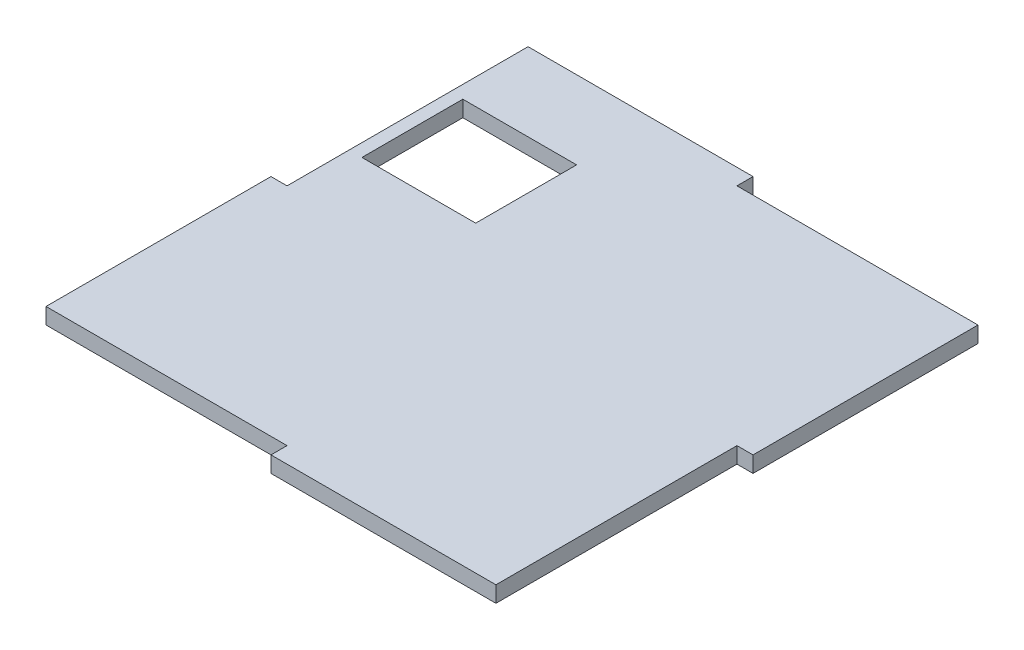
ISO-10303-21;
HEADER;
FILE_DESCRIPTION(('STEP AP214'),'2;1');
FILE_NAME('part.step','',(''),(''),'','','');
FILE_SCHEMA(('AUTOMOTIVE_DESIGN { 1 0 10303 214 1 1 1 1 }'));
ENDSEC;
DATA;
#1=APPLICATION_CONTEXT('core data for automotive mechanical design processes');
#2=APPLICATION_PROTOCOL_DEFINITION('international standard','automotive_design',2000,#1);
#3=PRODUCT_CONTEXT('',#1,'mechanical');
#4=PRODUCT('Part','Part','',(#3));
#5=PRODUCT_RELATED_PRODUCT_CATEGORY('part','',(#4));
#6=PRODUCT_DEFINITION_FORMATION('','',#4);
#7=PRODUCT_DEFINITION_CONTEXT('part definition',#1,'design');
#8=PRODUCT_DEFINITION('design','',#6,#7);
#9=PRODUCT_DEFINITION_SHAPE('','',#8);
#10=(LENGTH_UNIT() NAMED_UNIT(*) SI_UNIT(.MILLI.,.METRE.));
#11=(NAMED_UNIT(*) PLANE_ANGLE_UNIT() SI_UNIT($,.RADIAN.));
#12=(NAMED_UNIT(*) SI_UNIT($,.STERADIAN.) SOLID_ANGLE_UNIT());
#13=UNCERTAINTY_MEASURE_WITH_UNIT(LENGTH_MEASURE(1.E-05),#10,'distance_accuracy_value','');
#14=(GEOMETRIC_REPRESENTATION_CONTEXT(3) GLOBAL_UNCERTAINTY_ASSIGNED_CONTEXT((#13)) GLOBAL_UNIT_ASSIGNED_CONTEXT((#10,
#11,#12)) REPRESENTATION_CONTEXT('',''));
#15=CARTESIAN_POINT('',(0.,0.,0.));
#16=DIRECTION('',(0.,0.,1.));
#17=DIRECTION('',(1.,0.,0.));
#18=AXIS2_PLACEMENT_3D('',#15,#16,#17);
#19=CARTESIAN_POINT('',(-59.67561582829,6.35,0.));
#20=DIRECTION('',(-1.,0.,0.));
#21=DIRECTION('',(0.,0.,1.));
#22=AXIS2_PLACEMENT_3D('',#19,#20,#21);
#23=PLANE('',#22);
#24=DIRECTION('',(0.,0.,-1.));
#25=VECTOR('',#24,1.);
#26=CARTESIAN_POINT('',(-59.67561582829,0.,0.));
#27=LINE('',#26,#25);
#28=CARTESIAN_POINT('',(-59.67561582829,0.,-38.549165603342));
#29=VERTEX_POINT('',#28);
#30=CARTESIAN_POINT('',(-59.67561582829,0.,-78.427165603342));
#31=VERTEX_POINT('',#30);
#32=EDGE_CURVE('E225',#29,#31,#27,.T.);
#33=ORIENTED_EDGE('',*,*,#32,.F.);
#34=DIRECTION('',(0.,-1.,0.));
#35=VECTOR('',#34,1.);
#36=CARTESIAN_POINT('',(-59.67561582829,6.35,-38.549165603342));
#37=LINE('',#36,#35);
#38=CARTESIAN_POINT('',(-59.67561582829,6.35,-38.549165603342));
#39=VERTEX_POINT('',#38);
#40=EDGE_CURVE('E11',#39,#29,#37,.T.);
#41=ORIENTED_EDGE('',*,*,#40,.F.);
#42=DIRECTION('',(0.,0.,-1.));
#43=VECTOR('',#42,1.);
#44=CARTESIAN_POINT('',(-59.67561582829,6.35,0.));
#45=LINE('',#44,#43);
#46=CARTESIAN_POINT('',(-59.67561582829,6.35,-78.427165603342));
#47=VERTEX_POINT('',#46);
#48=EDGE_CURVE('E181',#39,#47,#45,.T.);
#49=ORIENTED_EDGE('',*,*,#48,.T.);
#50=DIRECTION('',(0.,-1.,0.));
#51=VECTOR('',#50,1.);
#52=CARTESIAN_POINT('',(-59.67561582829,6.35,-78.427165603342));
#53=LINE('',#52,#51);
#54=EDGE_CURVE('E119',#47,#31,#53,.T.);
#55=ORIENTED_EDGE('',*,*,#54,.T.);
#56=EDGE_LOOP('',(#33,#41,#49,#55));
#57=FACE_BOUND('',#56,.T.);
#58=ADVANCED_FACE('F41',(#57),#23,.T.);
#59=CARTESIAN_POINT('',(0.,6.35,-38.549165603342));
#60=DIRECTION('',(0.,0.,-1.));
#61=DIRECTION('',(-1.,0.,0.));
#62=AXIS2_PLACEMENT_3D('',#59,#60,#61);
#63=PLANE('',#62);
#64=DIRECTION('',(1.,0.,0.));
#65=VECTOR('',#64,1.);
#66=CARTESIAN_POINT('',(0.,0.,-38.549165603342));
#67=LINE('',#66,#65);
#68=CARTESIAN_POINT('',(-104.63361582829,0.,-38.549165603342));
#69=VERTEX_POINT('',#68);
#70=EDGE_CURVE('E171',#69,#29,#67,.T.);
#71=ORIENTED_EDGE('',*,*,#70,.F.);
#72=DIRECTION('',(0.,-1.,0.));
#73=VECTOR('',#72,1.);
#74=CARTESIAN_POINT('',(-104.63361582829,6.35,-38.549165603342));
#75=LINE('',#74,#73);
#76=CARTESIAN_POINT('',(-104.63361582829,6.35,-38.549165603342));
#77=VERTEX_POINT('',#76);
#78=EDGE_CURVE('E51',#77,#69,#75,.T.);
#79=ORIENTED_EDGE('',*,*,#78,.F.);
#80=DIRECTION('',(1.,0.,0.));
#81=VECTOR('',#80,1.);
#82=CARTESIAN_POINT('',(0.,6.35,-38.549165603342));
#83=LINE('',#82,#81);
#84=EDGE_CURVE('E169',#77,#39,#83,.T.);
#85=ORIENTED_EDGE('',*,*,#84,.T.);
#86=ORIENTED_EDGE('',*,*,#40,.T.);
#87=EDGE_LOOP('',(#71,#79,#85,#86));
#88=FACE_BOUND('',#87,.T.);
#89=ADVANCED_FACE('F167',(#88),#63,.T.);
#90=CARTESIAN_POINT('',(-104.63361582829,6.35,0.));
#91=DIRECTION('',(-1.,0.,0.));
#92=DIRECTION('',(0.,0.,1.));
#93=AXIS2_PLACEMENT_3D('',#90,#91,#92);
#94=PLANE('',#93);
#95=DIRECTION('',(0.,0.,-1.));
#96=VECTOR('',#95,1.);
#97=CARTESIAN_POINT('',(-104.63361582829,0.,0.));
#98=LINE('',#97,#96);
#99=CARTESIAN_POINT('',(-104.63361582829,0.,-78.427165603342));
#100=VERTEX_POINT('',#99);
#101=EDGE_CURVE('E228',#69,#100,#98,.T.);
#102=ORIENTED_EDGE('',*,*,#101,.T.);
#103=DIRECTION('',(0.,-1.,0.));
#104=VECTOR('',#103,1.);
#105=CARTESIAN_POINT('',(-104.63361582829,6.35,-78.427165603342));
#106=LINE('',#105,#104);
#107=CARTESIAN_POINT('',(-104.63361582829,6.35,-78.427165603342));
#108=VERTEX_POINT('',#107);
#109=EDGE_CURVE('E174',#108,#100,#106,.T.);
#110=ORIENTED_EDGE('',*,*,#109,.F.);
#111=DIRECTION('',(0.,0.,-1.));
#112=VECTOR('',#111,1.);
#113=CARTESIAN_POINT('',(-104.63361582829,6.35,0.));
#114=LINE('',#113,#112);
#115=EDGE_CURVE('E177',#77,#108,#114,.T.);
#116=ORIENTED_EDGE('',*,*,#115,.F.);
#117=ORIENTED_EDGE('',*,*,#78,.T.);
#118=EDGE_LOOP('',(#102,#110,#116,#117));
#119=FACE_BOUND('',#118,.T.);
#120=ADVANCED_FACE('F178',(#119),#94,.F.);
#121=CARTESIAN_POINT('',(0.,6.35,-14.038165603342));
#122=DIRECTION('',(0.,0.,-1.));
#123=DIRECTION('',(-1.,0.,0.));
#124=AXIS2_PLACEMENT_3D('',#121,#122,#123);
#125=PLANE('',#124);
#126=DIRECTION('',(1.,0.,0.));
#127=VECTOR('',#126,1.);
#128=CARTESIAN_POINT('',(0.,0.,-14.038165603342));
#129=LINE('',#128,#127);
#130=CARTESIAN_POINT('',(-116.06361582829,0.,-14.038165603342));
#131=VERTEX_POINT('',#130);
#132=CARTESIAN_POINT('',(-109.71361582829,0.,-14.038165603342));
#133=VERTEX_POINT('',#132);
#134=EDGE_CURVE('E189',#131,#133,#129,.T.);
#135=ORIENTED_EDGE('',*,*,#134,.F.);
#136=DIRECTION('',(0.,-1.,0.));
#137=VECTOR('',#136,1.);
#138=CARTESIAN_POINT('',(-116.06361582829,6.35,-14.038165603342));
#139=LINE('',#138,#137);
#140=CARTESIAN_POINT('',(-116.06361582829,6.35,-14.038165603342));
#141=VERTEX_POINT('',#140);
#142=EDGE_CURVE('E45',#141,#131,#139,.T.);
#143=ORIENTED_EDGE('',*,*,#142,.F.);
#144=DIRECTION('',(1.,0.,0.));
#145=VECTOR('',#144,1.);
#146=CARTESIAN_POINT('',(0.,6.35,-14.038165603342));
#147=LINE('',#146,#145);
#148=CARTESIAN_POINT('',(-109.71361582829,6.35,-14.038165603342));
#149=VERTEX_POINT('',#148);
#150=EDGE_CURVE('E231',#141,#149,#147,.T.);
#151=ORIENTED_EDGE('',*,*,#150,.T.);
#152=DIRECTION('',(0.,-1.,0.));
#153=VECTOR('',#152,1.);
#154=CARTESIAN_POINT('',(-109.71361582829,6.35,-14.038165603342));
#155=LINE('',#154,#153);
#156=EDGE_CURVE('E188',#149,#133,#155,.T.);
#157=ORIENTED_EDGE('',*,*,#156,.T.);
#158=EDGE_LOOP('',(#135,#143,#151,#157));
#159=FACE_BOUND('',#158,.T.);
#160=ADVANCED_FACE('F43',(#159),#125,.T.);
#161=CARTESIAN_POINT('',(-116.06361582829,6.35,0.));
#162=DIRECTION('',(-1.,0.,0.));
#163=DIRECTION('',(0.,0.,1.));
#164=AXIS2_PLACEMENT_3D('',#161,#162,#163);
#165=PLANE('',#164);
#166=DIRECTION('',(0.,0.,-1.));
#167=VECTOR('',#166,1.);
#168=CARTESIAN_POINT('',(-116.06361582829,0.,0.));
#169=LINE('',#168,#167);
#170=CARTESIAN_POINT('',(-116.06361582829,0.,74.8618343966579));
#171=VERTEX_POINT('',#170);
#172=EDGE_CURVE('E192',#171,#131,#169,.T.);
#173=ORIENTED_EDGE('',*,*,#172,.F.);
#174=DIRECTION('',(0.,-1.,0.));
#175=VECTOR('',#174,1.);
#176=CARTESIAN_POINT('',(-116.06361582829,6.35,74.8618343966579));
#177=LINE('',#176,#175);
#178=CARTESIAN_POINT('',(-116.06361582829,6.35,74.8618343966579));
#179=VERTEX_POINT('',#178);
#180=EDGE_CURVE('E252',#179,#171,#177,.T.);
#181=ORIENTED_EDGE('',*,*,#180,.F.);
#182=DIRECTION('',(0.,0.,-1.));
#183=VECTOR('',#182,1.);
#184=CARTESIAN_POINT('',(-116.06361582829,6.35,0.));
#185=LINE('',#184,#183);
#186=EDGE_CURVE('E261',#179,#141,#185,.T.);
#187=ORIENTED_EDGE('',*,*,#186,.T.);
#188=ORIENTED_EDGE('',*,*,#142,.T.);
#189=EDGE_LOOP('',(#173,#181,#187,#188));
#190=FACE_BOUND('',#189,.T.);
#191=ADVANCED_FACE('F259',(#190),#165,.T.);
#192=CARTESIAN_POINT('',(0.,6.35,74.8618343966579));
#193=DIRECTION('',(0.,0.,1.));
#194=DIRECTION('',(1.,0.,0.));
#195=AXIS2_PLACEMENT_3D('',#192,#193,#194);
#196=PLANE('',#195);
#197=DIRECTION('',(-1.,0.,0.));
#198=VECTOR('',#197,1.);
#199=CARTESIAN_POINT('',(0.,0.,74.8618343966579));
#200=LINE('',#199,#198);
#201=CARTESIAN_POINT('',(-20.81361582829,0.,74.8618343966579));
#202=VERTEX_POINT('',#201);
#203=EDGE_CURVE('E195',#202,#171,#200,.T.);
#204=ORIENTED_EDGE('',*,*,#203,.F.);
#205=DIRECTION('',(0.,-1.,0.));
#206=VECTOR('',#205,1.);
#207=CARTESIAN_POINT('',(-20.81361582829,6.35,74.8618343966579));
#208=LINE('',#207,#206);
#209=CARTESIAN_POINT('',(-20.81361582829,6.35,74.8618343966579));
#210=VERTEX_POINT('',#209);
#211=EDGE_CURVE('E251',#210,#202,#208,.T.);
#212=ORIENTED_EDGE('',*,*,#211,.F.);
#213=DIRECTION('',(-1.,0.,0.));
#214=VECTOR('',#213,1.);
#215=CARTESIAN_POINT('',(0.,6.35,74.8618343966579));
#216=LINE('',#215,#214);
#217=EDGE_CURVE('E269',#210,#179,#216,.T.);
#218=ORIENTED_EDGE('',*,*,#217,.T.);
#219=ORIENTED_EDGE('',*,*,#180,.T.);
#220=EDGE_LOOP('',(#204,#212,#218,#219));
#221=FACE_BOUND('',#220,.T.);
#222=ADVANCED_FACE('F267',(#221),#196,.T.);
#223=CARTESIAN_POINT('',(-20.81361582829,6.35,0.));
#224=DIRECTION('',(-1.,0.,0.));
#225=DIRECTION('',(0.,0.,1.));
#226=AXIS2_PLACEMENT_3D('',#223,#224,#225);
#227=PLANE('',#226);
#228=DIRECTION('',(0.,0.,-1.));
#229=VECTOR('',#228,1.);
#230=CARTESIAN_POINT('',(-20.81361582829,0.,0.));
#231=LINE('',#230,#229);
#232=CARTESIAN_POINT('',(-20.81361582829,0.,81.2118343966579));
#233=VERTEX_POINT('',#232);
#234=EDGE_CURVE('E198',#233,#202,#231,.T.);
#235=ORIENTED_EDGE('',*,*,#234,.F.);
#236=DIRECTION('',(0.,-1.,0.));
#237=VECTOR('',#236,1.);
#238=CARTESIAN_POINT('',(-20.81361582829,6.35,81.2118343966579));
#239=LINE('',#238,#237);
#240=CARTESIAN_POINT('',(-20.81361582829,6.35,81.2118343966579));
#241=VERTEX_POINT('',#240);
#242=EDGE_CURVE('E249',#241,#233,#239,.T.);
#243=ORIENTED_EDGE('',*,*,#242,.F.);
#244=DIRECTION('',(0.,0.,-1.));
#245=VECTOR('',#244,1.);
#246=CARTESIAN_POINT('',(-20.81361582829,6.35,0.));
#247=LINE('',#246,#245);
#248=EDGE_CURVE('E275',#241,#210,#247,.T.);
#249=ORIENTED_EDGE('',*,*,#248,.T.);
#250=ORIENTED_EDGE('',*,*,#211,.T.);
#251=EDGE_LOOP('',(#235,#243,#249,#250));
#252=FACE_BOUND('',#251,.T.);
#253=ADVANCED_FACE('F278',(#252),#227,.T.);
#254=CARTESIAN_POINT('',(0.,6.35,81.2118343966579));
#255=DIRECTION('',(0.,0.,1.));
#256=DIRECTION('',(1.,0.,0.));
#257=AXIS2_PLACEMENT_3D('',#254,#255,#256);
#258=PLANE('',#257);
#259=DIRECTION('',(-1.,0.,0.));
#260=VECTOR('',#259,1.);
#261=CARTESIAN_POINT('',(0.,0.,81.2118343966579));
#262=LINE('',#261,#260);
#263=CARTESIAN_POINT('',(68.08638417171,0.,81.2118343966579));
#264=VERTEX_POINT('',#263);
#265=EDGE_CURVE('E201',#264,#233,#262,.T.);
#266=ORIENTED_EDGE('',*,*,#265,.F.);
#267=DIRECTION('',(0.,-1.,0.));
#268=VECTOR('',#267,1.);
#269=CARTESIAN_POINT('',(68.08638417171,6.35,81.2118343966579));
#270=LINE('',#269,#268);
#271=CARTESIAN_POINT('',(68.08638417171,6.35,81.2118343966579));
#272=VERTEX_POINT('',#271);
#273=EDGE_CURVE('E247',#272,#264,#270,.T.);
#274=ORIENTED_EDGE('',*,*,#273,.F.);
#275=DIRECTION('',(-1.,0.,0.));
#276=VECTOR('',#275,1.);
#277=CARTESIAN_POINT('',(0.,6.35,81.2118343966579));
#278=LINE('',#277,#276);
#279=EDGE_CURVE('E279',#272,#241,#278,.T.);
#280=ORIENTED_EDGE('',*,*,#279,.T.);
#281=ORIENTED_EDGE('',*,*,#242,.T.);
#282=EDGE_LOOP('',(#266,#274,#280,#281));
#283=FACE_BOUND('',#282,.T.);
#284=ADVANCED_FACE('F331',(#283),#258,.T.);
#285=CARTESIAN_POINT('',(68.08638417171,6.35,0.));
#286=DIRECTION('',(1.,0.,0.));
#287=DIRECTION('',(0.,0.,-1.));
#288=AXIS2_PLACEMENT_3D('',#285,#286,#287);
#289=PLANE('',#288);
#290=DIRECTION('',(0.,0.,1.));
#291=VECTOR('',#290,1.);
#292=CARTESIAN_POINT('',(68.08638417171,0.,0.));
#293=LINE('',#292,#291);
#294=CARTESIAN_POINT('',(68.08638417171,0.,-14.038165603342));
#295=VERTEX_POINT('',#294);
#296=EDGE_CURVE('E204',#295,#264,#293,.T.);
#297=ORIENTED_EDGE('',*,*,#296,.F.);
#298=DIRECTION('',(0.,-1.,0.));
#299=VECTOR('',#298,1.);
#300=CARTESIAN_POINT('',(68.08638417171,6.35,-14.038165603342));
#301=LINE('',#300,#299);
#302=CARTESIAN_POINT('',(68.08638417171,6.35,-14.038165603342));
#303=VERTEX_POINT('',#302);
#304=EDGE_CURVE('E245',#303,#295,#301,.T.);
#305=ORIENTED_EDGE('',*,*,#304,.F.);
#306=DIRECTION('',(0.,0.,1.));
#307=VECTOR('',#306,1.);
#308=CARTESIAN_POINT('',(68.08638417171,6.35,0.));
#309=LINE('',#308,#307);
#310=EDGE_CURVE('E281',#303,#272,#309,.T.);
#311=ORIENTED_EDGE('',*,*,#310,.T.);
#312=ORIENTED_EDGE('',*,*,#273,.T.);
#313=EDGE_LOOP('',(#297,#305,#311,#312));
#314=FACE_BOUND('',#313,.T.);
#315=ADVANCED_FACE('F328',(#314),#289,.T.);
#316=CARTESIAN_POINT('',(0.,6.35,-14.038165603342));
#317=DIRECTION('',(0.,0.,1.));
#318=DIRECTION('',(1.,0.,0.));
#319=AXIS2_PLACEMENT_3D('',#316,#317,#318);
#320=PLANE('',#319);
#321=DIRECTION('',(-1.,0.,0.));
#322=VECTOR('',#321,1.);
#323=CARTESIAN_POINT('',(0.,0.,-14.038165603342));
#324=LINE('',#323,#322);
#325=CARTESIAN_POINT('',(74.43638417171,0.,-14.038165603342));
#326=VERTEX_POINT('',#325);
#327=EDGE_CURVE('E207',#326,#295,#324,.T.);
#328=ORIENTED_EDGE('',*,*,#327,.F.);
#329=DIRECTION('',(0.,-1.,0.));
#330=VECTOR('',#329,1.);
#331=CARTESIAN_POINT('',(74.43638417171,6.35,-14.038165603342));
#332=LINE('',#331,#330);
#333=CARTESIAN_POINT('',(74.43638417171,6.35,-14.038165603342));
#334=VERTEX_POINT('',#333);
#335=EDGE_CURVE('E243',#334,#326,#332,.T.);
#336=ORIENTED_EDGE('',*,*,#335,.F.);
#337=DIRECTION('',(-1.,0.,0.));
#338=VECTOR('',#337,1.);
#339=CARTESIAN_POINT('',(0.,6.35,-14.038165603342));
#340=LINE('',#339,#338);
#341=EDGE_CURVE('E287',#334,#303,#340,.T.);
#342=ORIENTED_EDGE('',*,*,#341,.T.);
#343=ORIENTED_EDGE('',*,*,#304,.T.);
#344=EDGE_LOOP('',(#328,#336,#342,#343));
#345=FACE_BOUND('',#344,.T.);
#346=ADVANCED_FACE('F324',(#345),#320,.T.);
#347=CARTESIAN_POINT('',(74.43638417171,6.35,0.));
#348=DIRECTION('',(1.,0.,0.));
#349=DIRECTION('',(0.,0.,-1.));
#350=AXIS2_PLACEMENT_3D('',#347,#348,#349);
#351=PLANE('',#350);
#352=DIRECTION('',(0.,0.,1.));
#353=VECTOR('',#352,1.);
#354=CARTESIAN_POINT('',(74.43638417171,0.,0.));
#355=LINE('',#354,#353);
#356=CARTESIAN_POINT('',(74.43638417171,0.,-102.938165603342));
#357=VERTEX_POINT('',#356);
#358=EDGE_CURVE('E210',#357,#326,#355,.T.);
#359=ORIENTED_EDGE('',*,*,#358,.F.);
#360=DIRECTION('',(0.,-1.,0.));
#361=VECTOR('',#360,1.);
#362=CARTESIAN_POINT('',(74.43638417171,6.35,-102.938165603342));
#363=LINE('',#362,#361);
#364=CARTESIAN_POINT('',(74.43638417171,6.35,-102.938165603342));
#365=VERTEX_POINT('',#364);
#366=EDGE_CURVE('E241',#365,#357,#363,.T.);
#367=ORIENTED_EDGE('',*,*,#366,.F.);
#368=DIRECTION('',(0.,0.,1.));
#369=VECTOR('',#368,1.);
#370=CARTESIAN_POINT('',(74.43638417171,6.35,0.));
#371=LINE('',#370,#369);
#372=EDGE_CURVE('E290',#365,#334,#371,.T.);
#373=ORIENTED_EDGE('',*,*,#372,.T.);
#374=ORIENTED_EDGE('',*,*,#335,.T.);
#375=EDGE_LOOP('',(#359,#367,#373,#374));
#376=FACE_BOUND('',#375,.T.);
#377=ADVANCED_FACE('F320',(#376),#351,.T.);
#378=CARTESIAN_POINT('',(0.,6.35,-102.938165603342));
#379=DIRECTION('',(0.,0.,-1.));
#380=DIRECTION('',(-1.,0.,0.));
#381=AXIS2_PLACEMENT_3D('',#378,#379,#380);
#382=PLANE('',#381);
#383=DIRECTION('',(1.,0.,0.));
#384=VECTOR('',#383,1.);
#385=CARTESIAN_POINT('',(0.,0.,-102.938165603342));
#386=LINE('',#385,#384);
#387=CARTESIAN_POINT('',(-20.81361582829,0.,-102.938165603342));
#388=VERTEX_POINT('',#387);
#389=EDGE_CURVE('E213',#388,#357,#386,.T.);
#390=ORIENTED_EDGE('',*,*,#389,.F.);
#391=DIRECTION('',(0.,-1.,0.));
#392=VECTOR('',#391,1.);
#393=CARTESIAN_POINT('',(-20.81361582829,6.35,-102.938165603342));
#394=LINE('',#393,#392);
#395=CARTESIAN_POINT('',(-20.81361582829,6.35,-102.938165603342));
#396=VERTEX_POINT('',#395);
#397=EDGE_CURVE('E239',#396,#388,#394,.T.);
#398=ORIENTED_EDGE('',*,*,#397,.F.);
#399=DIRECTION('',(1.,0.,0.));
#400=VECTOR('',#399,1.);
#401=CARTESIAN_POINT('',(0.,6.35,-102.938165603342));
#402=LINE('',#401,#400);
#403=EDGE_CURVE('E293',#396,#365,#402,.T.);
#404=ORIENTED_EDGE('',*,*,#403,.T.);
#405=ORIENTED_EDGE('',*,*,#366,.T.);
#406=EDGE_LOOP('',(#390,#398,#404,#405));
#407=FACE_BOUND('',#406,.T.);
#408=ADVANCED_FACE('F316',(#407),#382,.T.);
#409=CARTESIAN_POINT('',(-20.81361582829,6.35,0.));
#410=DIRECTION('',(1.,0.,0.));
#411=DIRECTION('',(0.,0.,-1.));
#412=AXIS2_PLACEMENT_3D('',#409,#410,#411);
#413=PLANE('',#412);
#414=DIRECTION('',(0.,0.,1.));
#415=VECTOR('',#414,1.);
#416=CARTESIAN_POINT('',(-20.81361582829,0.,0.));
#417=LINE('',#416,#415);
#418=CARTESIAN_POINT('',(-20.81361582829,0.,-109.288165603342));
#419=VERTEX_POINT('',#418);
#420=EDGE_CURVE('E216',#419,#388,#417,.T.);
#421=ORIENTED_EDGE('',*,*,#420,.F.);
#422=DIRECTION('',(0.,-1.,0.));
#423=VECTOR('',#422,1.);
#424=CARTESIAN_POINT('',(-20.81361582829,6.35,-109.288165603342));
#425=LINE('',#424,#423);
#426=CARTESIAN_POINT('',(-20.81361582829,6.35,-109.288165603342));
#427=VERTEX_POINT('',#426);
#428=EDGE_CURVE('E237',#427,#419,#425,.T.);
#429=ORIENTED_EDGE('',*,*,#428,.F.);
#430=DIRECTION('',(0.,0.,1.));
#431=VECTOR('',#430,1.);
#432=CARTESIAN_POINT('',(-20.81361582829,6.35,0.));
#433=LINE('',#432,#431);
#434=EDGE_CURVE('E296',#427,#396,#433,.T.);
#435=ORIENTED_EDGE('',*,*,#434,.T.);
#436=ORIENTED_EDGE('',*,*,#397,.T.);
#437=EDGE_LOOP('',(#421,#429,#435,#436));
#438=FACE_BOUND('',#437,.T.);
#439=ADVANCED_FACE('F312',(#438),#413,.T.);
#440=CARTESIAN_POINT('',(0.,6.35,-109.288165603342));
#441=DIRECTION('',(0.,0.,-1.));
#442=DIRECTION('',(-1.,0.,0.));
#443=AXIS2_PLACEMENT_3D('',#440,#441,#442);
#444=PLANE('',#443);
#445=DIRECTION('',(1.,0.,0.));
#446=VECTOR('',#445,1.);
#447=CARTESIAN_POINT('',(0.,0.,-109.288165603342));
#448=LINE('',#447,#446);
#449=CARTESIAN_POINT('',(-109.71361582829,0.,-109.288165603342));
#450=VERTEX_POINT('',#449);
#451=EDGE_CURVE('E219',#450,#419,#448,.T.);
#452=ORIENTED_EDGE('',*,*,#451,.F.);
#453=DIRECTION('',(0.,-1.,0.));
#454=VECTOR('',#453,1.);
#455=CARTESIAN_POINT('',(-109.71361582829,6.35,-109.288165603342));
#456=LINE('',#455,#454);
#457=CARTESIAN_POINT('',(-109.71361582829,6.35,-109.288165603342));
#458=VERTEX_POINT('',#457);
#459=EDGE_CURVE('E235',#458,#450,#456,.T.);
#460=ORIENTED_EDGE('',*,*,#459,.F.);
#461=DIRECTION('',(1.,0.,0.));
#462=VECTOR('',#461,1.);
#463=CARTESIAN_POINT('',(0.,6.35,-109.288165603342));
#464=LINE('',#463,#462);
#465=EDGE_CURVE('E299',#458,#427,#464,.T.);
#466=ORIENTED_EDGE('',*,*,#465,.T.);
#467=ORIENTED_EDGE('',*,*,#428,.T.);
#468=EDGE_LOOP('',(#452,#460,#466,#467));
#469=FACE_BOUND('',#468,.T.);
#470=ADVANCED_FACE('F309',(#469),#444,.T.);
#471=CARTESIAN_POINT('',(-109.71361582829,6.35,0.));
#472=DIRECTION('',(1.,0.,0.));
#473=DIRECTION('',(0.,0.,-1.));
#474=AXIS2_PLACEMENT_3D('',#471,#472,#473);
#475=PLANE('',#474);
#476=DIRECTION('',(0.,0.,1.));
#477=VECTOR('',#476,1.);
#478=CARTESIAN_POINT('',(-109.71361582829,0.,0.));
#479=LINE('',#478,#477);
#480=EDGE_CURVE('E222',#450,#133,#479,.T.);
#481=ORIENTED_EDGE('',*,*,#480,.T.);
#482=ORIENTED_EDGE('',*,*,#156,.F.);
#483=DIRECTION('',(0.,0.,1.));
#484=VECTOR('',#483,1.);
#485=CARTESIAN_POINT('',(-109.71361582829,6.35,0.));
#486=LINE('',#485,#484);
#487=EDGE_CURVE('E183',#458,#149,#486,.T.);
#488=ORIENTED_EDGE('',*,*,#487,.F.);
#489=ORIENTED_EDGE('',*,*,#459,.T.);
#490=EDGE_LOOP('',(#481,#482,#488,#489));
#491=FACE_BOUND('',#490,.T.);
#492=ADVANCED_FACE('F305',(#491),#475,.F.);
#493=CARTESIAN_POINT('',(0.,6.35,-78.427165603342));
#494=DIRECTION('',(0.,0.,-1.));
#495=DIRECTION('',(-1.,0.,0.));
#496=AXIS2_PLACEMENT_3D('',#493,#494,#495);
#497=PLANE('',#496);
#498=DIRECTION('',(1.,0.,0.));
#499=VECTOR('',#498,1.);
#500=CARTESIAN_POINT('',(0.,0.,-78.427165603342));
#501=LINE('',#500,#499);
#502=EDGE_CURVE('E112',#100,#31,#501,.T.);
#503=ORIENTED_EDGE('',*,*,#502,.T.);
#504=ORIENTED_EDGE('',*,*,#54,.F.);
#505=DIRECTION('',(1.,0.,0.));
#506=VECTOR('',#505,1.);
#507=CARTESIAN_POINT('',(0.,6.35,-78.427165603342));
#508=LINE('',#507,#506);
#509=EDGE_CURVE('E60',#108,#47,#508,.T.);
#510=ORIENTED_EDGE('',*,*,#509,.F.);
#511=ORIENTED_EDGE('',*,*,#109,.T.);
#512=EDGE_LOOP('',(#503,#504,#510,#511));
#513=FACE_BOUND('',#512,.T.);
#514=ADVANCED_FACE('F350',(#513),#497,.F.);
#515=CARTESIAN_POINT('',(0.,6.35,0.));
#516=DIRECTION('',(0.,1.,0.));
#517=DIRECTION('',(0.,0.,1.));
#518=AXIS2_PLACEMENT_3D('',#515,#516,#517);
#519=PLANE('',#518);
#520=ORIENTED_EDGE('',*,*,#150,.F.);
#521=ORIENTED_EDGE('',*,*,#186,.F.);
#522=ORIENTED_EDGE('',*,*,#217,.F.);
#523=ORIENTED_EDGE('',*,*,#248,.F.);
#524=ORIENTED_EDGE('',*,*,#279,.F.);
#525=ORIENTED_EDGE('',*,*,#310,.F.);
#526=ORIENTED_EDGE('',*,*,#341,.F.);
#527=ORIENTED_EDGE('',*,*,#372,.F.);
#528=ORIENTED_EDGE('',*,*,#403,.F.);
#529=ORIENTED_EDGE('',*,*,#434,.F.);
#530=ORIENTED_EDGE('',*,*,#465,.F.);
#531=ORIENTED_EDGE('',*,*,#487,.T.);
#532=EDGE_LOOP('',(#520,#521,#522,#523,#524,#525,#526,#527,#528,#529,#530,#531));
#533=FACE_BOUND('',#532,.T.);
#534=ORIENTED_EDGE('',*,*,#48,.F.);
#535=ORIENTED_EDGE('',*,*,#84,.F.);
#536=ORIENTED_EDGE('',*,*,#115,.T.);
#537=ORIENTED_EDGE('',*,*,#509,.T.);
#538=EDGE_LOOP('',(#534,#535,#536,#537));
#539=FACE_BOUND('',#538,.T.);
#540=ADVANCED_FACE('F180',(#533,#539),#519,.T.);
#541=CARTESIAN_POINT('',(0.,0.,0.));
#542=DIRECTION('',(0.,1.,0.));
#543=DIRECTION('',(0.,0.,1.));
#544=AXIS2_PLACEMENT_3D('',#541,#542,#543);
#545=PLANE('',#544);
#546=ORIENTED_EDGE('',*,*,#134,.T.);
#547=ORIENTED_EDGE('',*,*,#480,.F.);
#548=ORIENTED_EDGE('',*,*,#451,.T.);
#549=ORIENTED_EDGE('',*,*,#420,.T.);
#550=ORIENTED_EDGE('',*,*,#389,.T.);
#551=ORIENTED_EDGE('',*,*,#358,.T.);
#552=ORIENTED_EDGE('',*,*,#327,.T.);
#553=ORIENTED_EDGE('',*,*,#296,.T.);
#554=ORIENTED_EDGE('',*,*,#265,.T.);
#555=ORIENTED_EDGE('',*,*,#234,.T.);
#556=ORIENTED_EDGE('',*,*,#203,.T.);
#557=ORIENTED_EDGE('',*,*,#172,.T.);
#558=EDGE_LOOP('',(#546,#547,#548,#549,#550,#551,#552,#553,#554,#555,#556,#557));
#559=FACE_BOUND('',#558,.T.);
#560=ORIENTED_EDGE('',*,*,#32,.T.);
#561=ORIENTED_EDGE('',*,*,#502,.F.);
#562=ORIENTED_EDGE('',*,*,#101,.F.);
#563=ORIENTED_EDGE('',*,*,#70,.T.);
#564=EDGE_LOOP('',(#560,#561,#562,#563));
#565=FACE_BOUND('',#564,.T.);
#566=ADVANCED_FACE('F265',(#559,#565),#545,.F.);
#567=CLOSED_SHELL('',(#58,#89,#120,#160,#191,#222,#253,#284,#315,#346,#377,#408,#439,#470,#492,
#514,#540,#566));
#568=MANIFOLD_SOLID_BREP('B2',#567);
#569=ADVANCED_BREP_SHAPE_REPRESENTATION('',(#18,#568),#14);
#570=SHAPE_DEFINITION_REPRESENTATION(#9,#569);
ENDSEC;
END-ISO-10303-21;
